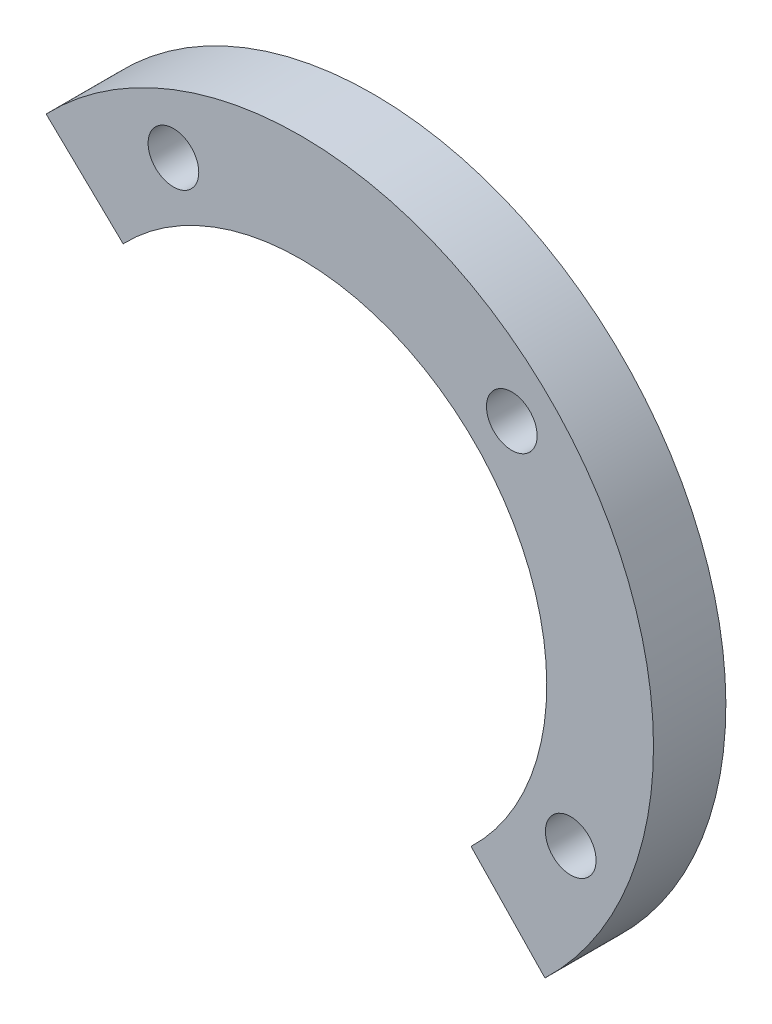
ISO-10303-21;
HEADER;
FILE_DESCRIPTION(('STEP AP214'),'2;1');
FILE_NAME('part.step','',(''),(''),'','','');
FILE_SCHEMA(('AUTOMOTIVE_DESIGN { 1 0 10303 214 1 1 1 1 }'));
ENDSEC;
DATA;
#1=APPLICATION_CONTEXT('core data for automotive mechanical design processes');
#2=APPLICATION_PROTOCOL_DEFINITION('international standard','automotive_design',2000,#1);
#3=PRODUCT_CONTEXT('',#1,'mechanical');
#4=PRODUCT('Part','Part','',(#3));
#5=PRODUCT_RELATED_PRODUCT_CATEGORY('part','',(#4));
#6=PRODUCT_DEFINITION_FORMATION('','',#4);
#7=PRODUCT_DEFINITION_CONTEXT('part definition',#1,'design');
#8=PRODUCT_DEFINITION('design','',#6,#7);
#9=PRODUCT_DEFINITION_SHAPE('','',#8);
#10=(LENGTH_UNIT() NAMED_UNIT(*) SI_UNIT(.MILLI.,.METRE.));
#11=(NAMED_UNIT(*) PLANE_ANGLE_UNIT() SI_UNIT($,.RADIAN.));
#12=(NAMED_UNIT(*) SI_UNIT($,.STERADIAN.) SOLID_ANGLE_UNIT());
#13=UNCERTAINTY_MEASURE_WITH_UNIT(LENGTH_MEASURE(1.E-05),#10,'distance_accuracy_value','');
#14=(GEOMETRIC_REPRESENTATION_CONTEXT(3) GLOBAL_UNCERTAINTY_ASSIGNED_CONTEXT((#13)) GLOBAL_UNIT_ASSIGNED_CONTEXT((#10,
#11,#12)) REPRESENTATION_CONTEXT('',''));
#15=CARTESIAN_POINT('',(0.,0.,0.));
#16=DIRECTION('',(0.,0.,1.));
#17=DIRECTION('',(1.,0.,0.));
#18=AXIS2_PLACEMENT_3D('',#15,#16,#17);
#19=CARTESIAN_POINT('',(0.,0.,0.));
#20=DIRECTION('',(0.,0.,1.));
#21=DIRECTION('',(1.,0.,0.));
#22=AXIS2_PLACEMENT_3D('',#19,#20,#21);
#23=PLANE('',#22);
#24=CARTESIAN_POINT('',(76.667261889578,76.6672618895781,0.));
#25=DIRECTION('',(0.,0.,1.));
#26=DIRECTION('',(1.,0.,0.));
#27=AXIS2_PLACEMENT_3D('',#24,#25,#26);
#28=CIRCLE('',#27,1.4);
#29=CARTESIAN_POINT('',(78.067261889578,76.6672618895781,0.));
#30=VERTEX_POINT('',#29);
#31=EDGE_CURVE('E385',#30,#30,#28,.T.);
#32=ORIENTED_EDGE('',*,*,#31,.T.);
#33=EDGE_LOOP('',(#32));
#34=FACE_BOUND('',#33,.T.);
#35=CARTESIAN_POINT('',(79.9252814189537,57.9653731751401,0.));
#36=DIRECTION('',(0.,0.,1.));
#37=DIRECTION('',(1.,0.,0.));
#38=AXIS2_PLACEMENT_3D('',#35,#36,#37);
#39=CIRCLE('',#38,1.40000000000002);
#40=CARTESIAN_POINT('',(81.3252814189537,57.9653731751401,0.));
#41=VERTEX_POINT('',#40);
#42=EDGE_CURVE('E410',#41,#41,#39,.T.);
#43=ORIENTED_EDGE('',*,*,#42,.T.);
#44=EDGE_LOOP('',(#43));
#45=FACE_BOUND('',#44,.T.);
#46=CARTESIAN_POINT('',(64.9999999999999,65.,0.));
#47=DIRECTION('',(0.,0.,1.));
#48=DIRECTION('',(1.,0.,0.));
#49=AXIS2_PLACEMENT_3D('',#46,#47,#48);
#50=CIRCLE('',#49,13.6000000000001);
#51=CARTESIAN_POINT('',(74.4153846153846,55.1862070256003,0.));
#52=VERTEX_POINT('',#51);
#53=CARTESIAN_POINT('',(55.1862070256001,74.4153846153847,0.));
#54=VERTEX_POINT('',#53);
#55=EDGE_CURVE('E400',#52,#54,#50,.T.);
#56=ORIENTED_EDGE('',*,*,#55,.T.);
#57=DIRECTION('',(0.721602424588225,-0.692307692307687,0.));
#58=VECTOR('',#57,1.);
#59=CARTESIAN_POINT('',(63.6259552603156,66.3182629526243,0.));
#60=LINE('',#59,#58);
#61=CARTESIAN_POINT('',(50.9287527205296,78.5,0.));
#62=VERTEX_POINT('',#61);
#63=EDGE_CURVE('E408',#62,#54,#60,.T.);
#64=ORIENTED_EDGE('',*,*,#63,.F.);
#65=CARTESIAN_POINT('',(64.9999999999999,65.,0.));
#66=DIRECTION('',(0.,0.,1.));
#67=DIRECTION('',(1.,0.,0.));
#68=AXIS2_PLACEMENT_3D('',#65,#66,#67);
#69=CIRCLE('',#68,19.5);
#70=CARTESIAN_POINT('',(78.5,50.9287527205298,0.));
#71=VERTEX_POINT('',#70);
#72=EDGE_CURVE('E406',#71,#62,#69,.T.);
#73=ORIENTED_EDGE('',*,*,#72,.F.);
#74=DIRECTION('',(-0.692307692307695,0.721602424588217,0.));
#75=VECTOR('',#74,1.);
#76=CARTESIAN_POINT('',(66.3182629526235,63.6259552603163,0.));
#77=LINE('',#76,#75);
#78=EDGE_CURVE('E403',#71,#52,#77,.T.);
#79=ORIENTED_EDGE('',*,*,#78,.T.);
#80=EDGE_LOOP('',(#56,#64,#73,#79));
#81=FACE_BOUND('',#80,.T.);
#82=CARTESIAN_POINT('',(57.8086613037912,78.0450495101681,0.));
#83=DIRECTION('',(0.,0.,1.));
#84=DIRECTION('',(1.,0.,0.));
#85=AXIS2_PLACEMENT_3D('',#82,#83,#84);
#86=CIRCLE('',#85,1.);
#87=CARTESIAN_POINT('',(56.9040987935516,77.6187084904796,0.));
#88=VERTEX_POINT('',#87);
#89=CARTESIAN_POINT('',(58.6301647126365,77.4748459068337,0.));
#90=VERTEX_POINT('',#89);
#91=EDGE_CURVE('E358',#88,#90,#86,.T.);
#92=ORIENTED_EDGE('',*,*,#91,.T.);
#93=DIRECTION('',(0.904562510239611,0.426341019688481,0.));
#94=VECTOR('',#93,1.);
#95=CARTESIAN_POINT('',(57.725602202397,77.0485048871453,0.));
#96=LINE('',#95,#94);
#97=CARTESIAN_POINT('',(59.4322867360858,77.8529043798754,0.));
#98=VERTEX_POINT('',#97);
#99=EDGE_CURVE('E664',#90,#98,#96,.T.);
#100=ORIENTED_EDGE('',*,*,#99,.T.);
#101=CARTESIAN_POINT('',(59.51534583748,78.8494490028982,0.));
#102=DIRECTION('',(0.,0.,1.));
#103=DIRECTION('',(1.,0.,0.));
#104=AXIS2_PLACEMENT_3D('',#101,#102,#103);
#105=CIRCLE('',#104,0.999999999999998);
#106=CARTESIAN_POINT('',(60.4199083477196,79.2757900225866,0.));
#107=VERTEX_POINT('',#106);
#108=EDGE_CURVE('E364',#98,#107,#105,.T.);
#109=ORIENTED_EDGE('',*,*,#108,.T.);
#110=DIRECTION('',(0.0830591013942119,0.996544623022766,0.));
#111=VECTOR('',#110,1.);
#112=CARTESIAN_POINT('',(60.3368492463254,78.2792453995639,0.));
#113=LINE('',#112,#111);
#114=CARTESIAN_POINT('',(60.4935611176742,80.1594773083495,0.));
#115=VERTEX_POINT('',#114);
#116=EDGE_CURVE('E349',#107,#115,#113,.T.);
#117=ORIENTED_EDGE('',*,*,#116,.T.);
#118=CARTESIAN_POINT('',(59.6720577088288,80.7296809116838,0.));
#119=DIRECTION('',(0.,0.,1.));
#120=DIRECTION('',(1.,0.,0.));
#121=AXIS2_PLACEMENT_3D('',#118,#119,#120);
#122=CIRCLE('',#121,1.);
#123=CARTESIAN_POINT('',(59.755116810223,81.7262255347065,0.));
#124=VERTEX_POINT('',#123);
#125=EDGE_CURVE('E370',#115,#124,#122,.T.);
#126=ORIENTED_EDGE('',*,*,#125,.T.);
#127=DIRECTION('',(-0.821503408845396,0.570203603334278,0.));
#128=VECTOR('',#127,1.);
#129=CARTESIAN_POINT('',(60.5766202190684,81.1560219313723,0.));
#130=LINE('',#129,#128);
#131=CARTESIAN_POINT('',(59.0266475567284,82.2318543474276,0.));
#132=VERTEX_POINT('',#131);
#133=EDGE_CURVE('E345',#124,#132,#130,.T.);
#134=ORIENTED_EDGE('',*,*,#133,.T.);
#135=CARTESIAN_POINT('',(58.1220850464888,81.8055133277392,0.));
#136=DIRECTION('',(0.,0.,1.));
#137=DIRECTION('',(1.,0.,0.));
#138=AXIS2_PLACEMENT_3D('',#135,#136,#137);
#139=CIRCLE('',#138,1.);
#140=CARTESIAN_POINT('',(57.3005816376434,82.3757169310735,0.));
#141=VERTEX_POINT('',#140);
#142=EDGE_CURVE('E343',#132,#141,#139,.T.);
#143=ORIENTED_EDGE('',*,*,#142,.T.);
#144=DIRECTION('',(-0.904562510239611,-0.426341019688481,0.));
#145=VECTOR('',#144,1.);
#146=CARTESIAN_POINT('',(58.205144147883,82.8020579507619,0.));
#147=LINE('',#146,#145);
#148=CARTESIAN_POINT('',(56.4984596141942,81.9976584580318,0.));
#149=VERTEX_POINT('',#148);
#150=EDGE_CURVE('E322',#141,#149,#147,.T.);
#151=ORIENTED_EDGE('',*,*,#150,.T.);
#152=CARTESIAN_POINT('',(56.4154005127999,81.0011138350091,0.));
#153=DIRECTION('',(0.,0.,1.));
#154=DIRECTION('',(1.,0.,0.));
#155=AXIS2_PLACEMENT_3D('',#152,#153,#154);
#156=CIRCLE('',#155,0.999999999999993);
#157=CARTESIAN_POINT('',(55.5108380025603,80.5747728153206,0.));
#158=VERTEX_POINT('',#157);
#159=EDGE_CURVE('E332',#149,#158,#156,.T.);
#160=ORIENTED_EDGE('',*,*,#159,.T.);
#161=DIRECTION('',(-0.083059101394217,-0.996544623022765,0.));
#162=VECTOR('',#161,1.);
#163=CARTESIAN_POINT('',(55.5938971039546,81.5713174383433,0.));
#164=LINE('',#163,#162);
#165=CARTESIAN_POINT('',(55.4371852326058,79.6910855295578,0.));
#166=VERTEX_POINT('',#165);
#167=EDGE_CURVE('E344',#158,#166,#164,.T.);
#168=ORIENTED_EDGE('',*,*,#167,.T.);
#169=CARTESIAN_POINT('',(56.2586886414512,79.1208819262235,0.));
#170=DIRECTION('',(0.,0.,1.));
#171=DIRECTION('',(1.,0.,0.));
#172=AXIS2_PLACEMENT_3D('',#169,#170,#171);
#173=CIRCLE('',#172,1.00000000000001);
#174=CARTESIAN_POINT('',(56.175629540057,78.1243373032007,0.));
#175=VERTEX_POINT('',#174);
#176=EDGE_CURVE('E213',#166,#175,#173,.T.);
#177=ORIENTED_EDGE('',*,*,#176,.T.);
#178=DIRECTION('',(0.821503408845395,-0.570203603334279,0.));
#179=VECTOR('',#178,1.);
#180=CARTESIAN_POINT('',(55.3541261312116,78.694540906535,0.));
#181=LINE('',#180,#179);
#182=EDGE_CURVE('E661',#175,#88,#181,.T.);
#183=ORIENTED_EDGE('',*,*,#182,.T.);
#184=EDGE_LOOP('',(#92,#100,#109,#117,#126,#134,#143,#151,#160,#168,#177,#183));
#185=FACE_BOUND('',#184,.T.);
#186=ADVANCED_FACE('F197',(#34,#45,#81,#185),#23,.F.);
#187=CARTESIAN_POINT('',(64.9999999999999,65.,4.));
#188=DIRECTION('',(0.,0.,-1.));
#189=DIRECTION('',(-1.,0.,0.));
#190=AXIS2_PLACEMENT_3D('',#187,#188,#189);
#191=CYLINDRICAL_SURFACE('',#190,13.6000000000001);
#192=ORIENTED_EDGE('',*,*,#55,.F.);
#193=DIRECTION('',(0.,0.,-1.));
#194=VECTOR('',#193,1.);
#195=CARTESIAN_POINT('',(74.4153846153846,55.1862070256003,4.));
#196=LINE('',#195,#194);
#197=CARTESIAN_POINT('',(74.4153846153846,55.1862070256003,4.));
#198=VERTEX_POINT('',#197);
#199=EDGE_CURVE('E12',#198,#52,#196,.T.);
#200=ORIENTED_EDGE('',*,*,#199,.F.);
#201=CARTESIAN_POINT('',(64.9999999999999,65.,4.));
#202=DIRECTION('',(0.,0.,1.));
#203=DIRECTION('',(1.,0.,0.));
#204=AXIS2_PLACEMENT_3D('',#201,#202,#203);
#205=CIRCLE('',#204,13.6000000000001);
#206=CARTESIAN_POINT('',(55.1862070256001,74.4153846153847,4.));
#207=VERTEX_POINT('',#206);
#208=EDGE_CURVE('E382',#198,#207,#205,.T.);
#209=ORIENTED_EDGE('',*,*,#208,.T.);
#210=DIRECTION('',(0.,0.,-1.));
#211=VECTOR('',#210,1.);
#212=CARTESIAN_POINT('',(55.1862070256001,74.4153846153847,4.));
#213=LINE('',#212,#211);
#214=EDGE_CURVE('E242',#207,#54,#213,.T.);
#215=ORIENTED_EDGE('',*,*,#214,.T.);
#216=EDGE_LOOP('',(#192,#200,#209,#215));
#217=FACE_BOUND('',#216,.T.);
#218=ADVANCED_FACE('F199',(#217),#191,.F.);
#219=CARTESIAN_POINT('',(66.3182629526235,63.6259552603163,4.));
#220=DIRECTION('',(-0.721602424588217,-0.692307692307695,0.));
#221=DIRECTION('',(0.692307692307695,-0.721602424588217,0.));
#222=AXIS2_PLACEMENT_3D('',#219,#220,#221);
#223=PLANE('',#222);
#224=ORIENTED_EDGE('',*,*,#78,.F.);
#225=DIRECTION('',(0.,0.,-1.));
#226=VECTOR('',#225,1.);
#227=CARTESIAN_POINT('',(78.5,50.9287527205298,4.));
#228=LINE('',#227,#226);
#229=CARTESIAN_POINT('',(78.5,50.9287527205298,4.));
#230=VERTEX_POINT('',#229);
#231=EDGE_CURVE('E206',#230,#71,#228,.T.);
#232=ORIENTED_EDGE('',*,*,#231,.F.);
#233=DIRECTION('',(-0.692307692307695,0.721602424588217,0.));
#234=VECTOR('',#233,1.);
#235=CARTESIAN_POINT('',(66.3182629526235,63.6259552603163,4.));
#236=LINE('',#235,#234);
#237=EDGE_CURVE('E384',#230,#198,#236,.T.);
#238=ORIENTED_EDGE('',*,*,#237,.T.);
#239=ORIENTED_EDGE('',*,*,#199,.T.);
#240=EDGE_LOOP('',(#224,#232,#238,#239));
#241=FACE_BOUND('',#240,.T.);
#242=ADVANCED_FACE('F429',(#241),#223,.T.);
#243=CARTESIAN_POINT('',(64.9999999999999,65.,4.));
#244=DIRECTION('',(0.,0.,-1.));
#245=DIRECTION('',(-1.,0.,0.));
#246=AXIS2_PLACEMENT_3D('',#243,#244,#245);
#247=CYLINDRICAL_SURFACE('',#246,19.5);
#248=ORIENTED_EDGE('',*,*,#72,.T.);
#249=DIRECTION('',(0.,0.,-1.));
#250=VECTOR('',#249,1.);
#251=CARTESIAN_POINT('',(50.9287527205296,78.5,4.));
#252=LINE('',#251,#250);
#253=CARTESIAN_POINT('',(50.9287527205296,78.5,4.));
#254=VERTEX_POINT('',#253);
#255=EDGE_CURVE('E416',#254,#62,#252,.T.);
#256=ORIENTED_EDGE('',*,*,#255,.F.);
#257=CARTESIAN_POINT('',(64.9999999999999,65.,4.));
#258=DIRECTION('',(0.,0.,1.));
#259=DIRECTION('',(1.,0.,0.));
#260=AXIS2_PLACEMENT_3D('',#257,#258,#259);
#261=CIRCLE('',#260,19.5);
#262=EDGE_CURVE('E388',#230,#254,#261,.T.);
#263=ORIENTED_EDGE('',*,*,#262,.F.);
#264=ORIENTED_EDGE('',*,*,#231,.T.);
#265=EDGE_LOOP('',(#248,#256,#263,#264));
#266=FACE_BOUND('',#265,.T.);
#267=ADVANCED_FACE('F422',(#266),#247,.T.);
#268=CARTESIAN_POINT('',(76.667261889578,76.6672618895781,4.));
#269=DIRECTION('',(0.,0.,-1.));
#270=DIRECTION('',(-1.,0.,0.));
#271=AXIS2_PLACEMENT_3D('',#268,#269,#270);
#272=CYLINDRICAL_SURFACE('',#271,1.4);
#273=CARTESIAN_POINT('',(76.667261889578,76.6672618895781,4.));
#274=DIRECTION('',(0.,0.,1.));
#275=DIRECTION('',(1.,0.,0.));
#276=AXIS2_PLACEMENT_3D('',#273,#274,#275);
#277=CIRCLE('',#276,1.4);
#278=CARTESIAN_POINT('',(78.067261889578,76.6672618895781,4.));
#279=VERTEX_POINT('',#278);
#280=EDGE_CURVE('E394',#279,#279,#277,.T.);
#281=ORIENTED_EDGE('',*,*,#280,.T.);
#282=EDGE_LOOP('',(#281));
#283=FACE_BOUND('',#282,.T.);
#284=ORIENTED_EDGE('',*,*,#31,.F.);
#285=EDGE_LOOP('',(#284));
#286=FACE_BOUND('',#285,.T.);
#287=ADVANCED_FACE('F449',(#283,#286),#272,.F.);
#288=CARTESIAN_POINT('',(79.9252814189537,57.9653731751401,4.));
#289=DIRECTION('',(0.,0.,-1.));
#290=DIRECTION('',(-1.,0.,0.));
#291=AXIS2_PLACEMENT_3D('',#288,#289,#290);
#292=CYLINDRICAL_SURFACE('',#291,1.40000000000002);
#293=CARTESIAN_POINT('',(79.9252814189537,57.9653731751401,4.));
#294=DIRECTION('',(0.,0.,1.));
#295=DIRECTION('',(1.,0.,0.));
#296=AXIS2_PLACEMENT_3D('',#293,#294,#295);
#297=CIRCLE('',#296,1.40000000000002);
#298=CARTESIAN_POINT('',(81.3252814189537,57.9653731751401,4.));
#299=VERTEX_POINT('',#298);
#300=EDGE_CURVE('E391',#299,#299,#297,.T.);
#301=ORIENTED_EDGE('',*,*,#300,.T.);
#302=EDGE_LOOP('',(#301));
#303=FACE_BOUND('',#302,.T.);
#304=ORIENTED_EDGE('',*,*,#42,.F.);
#305=EDGE_LOOP('',(#304));
#306=FACE_BOUND('',#305,.T.);
#307=ADVANCED_FACE('F452',(#303,#306),#292,.F.);
#308=CARTESIAN_POINT('',(63.6259552603156,66.3182629526243,4.));
#309=DIRECTION('',(0.692307692307687,0.721602424588225,0.));
#310=DIRECTION('',(-0.721602424588225,0.692307692307687,0.));
#311=AXIS2_PLACEMENT_3D('',#308,#309,#310);
#312=PLANE('',#311);
#313=ORIENTED_EDGE('',*,*,#63,.T.);
#314=ORIENTED_EDGE('',*,*,#214,.F.);
#315=DIRECTION('',(0.721602424588225,-0.692307692307687,0.));
#316=VECTOR('',#315,1.);
#317=CARTESIAN_POINT('',(63.6259552603156,66.3182629526243,4.));
#318=LINE('',#317,#316);
#319=EDGE_CURVE('E222',#254,#207,#318,.T.);
#320=ORIENTED_EDGE('',*,*,#319,.F.);
#321=ORIENTED_EDGE('',*,*,#255,.T.);
#322=EDGE_LOOP('',(#313,#314,#320,#321));
#323=FACE_BOUND('',#322,.T.);
#324=ADVANCED_FACE('F447',(#323),#312,.F.);
#325=CARTESIAN_POINT('',(57.96537317514,79.9252814189536,4.));
#326=DIRECTION('',(0.,0.,-1.));
#327=DIRECTION('',(-1.,0.,0.));
#328=AXIS2_PLACEMENT_3D('',#325,#326,#327);
#329=CYLINDRICAL_SURFACE('',#328,1.4);
#330=CARTESIAN_POINT('',(57.96537317514,79.9252814189536,2.));
#331=DIRECTION('',(0.,0.,1.));
#332=DIRECTION('',(1.,0.,0.));
#333=AXIS2_PLACEMENT_3D('',#330,#331,#332);
#334=CIRCLE('',#333,1.4);
#335=CARTESIAN_POINT('',(59.36537317514,79.9252814189536,2.));
#336=VERTEX_POINT('',#335);
#337=EDGE_CURVE('E201',#336,#336,#334,.T.);
#338=ORIENTED_EDGE('',*,*,#337,.F.);
#339=EDGE_LOOP('',(#338));
#340=FACE_BOUND('',#339,.T.);
#341=CARTESIAN_POINT('',(57.96537317514,79.9252814189536,4.));
#342=DIRECTION('',(0.,0.,1.));
#343=DIRECTION('',(1.,0.,0.));
#344=AXIS2_PLACEMENT_3D('',#341,#342,#343);
#345=CIRCLE('',#344,1.4);
#346=CARTESIAN_POINT('',(59.36537317514,79.9252814189536,4.));
#347=VERTEX_POINT('',#346);
#348=EDGE_CURVE('E397',#347,#347,#345,.T.);
#349=ORIENTED_EDGE('',*,*,#348,.T.);
#350=EDGE_LOOP('',(#349));
#351=FACE_BOUND('',#350,.T.);
#352=ADVANCED_FACE('F444',(#340,#351),#329,.F.);
#353=CARTESIAN_POINT('',(0.,0.,4.));
#354=DIRECTION('',(0.,0.,1.));
#355=DIRECTION('',(1.,0.,0.));
#356=AXIS2_PLACEMENT_3D('',#353,#354,#355);
#357=PLANE('',#356);
#358=ORIENTED_EDGE('',*,*,#208,.F.);
#359=ORIENTED_EDGE('',*,*,#237,.F.);
#360=ORIENTED_EDGE('',*,*,#262,.T.);
#361=ORIENTED_EDGE('',*,*,#319,.T.);
#362=EDGE_LOOP('',(#358,#359,#360,#361));
#363=FACE_BOUND('',#362,.T.);
#364=ORIENTED_EDGE('',*,*,#300,.F.);
#365=EDGE_LOOP('',(#364));
#366=FACE_BOUND('',#365,.T.);
#367=ORIENTED_EDGE('',*,*,#280,.F.);
#368=EDGE_LOOP('',(#367));
#369=FACE_BOUND('',#368,.T.);
#370=ORIENTED_EDGE('',*,*,#348,.F.);
#371=EDGE_LOOP('',(#370));
#372=FACE_BOUND('',#371,.T.);
#373=ADVANCED_FACE('F442',(#363,#366,#369,#372),#357,.T.);
#374=CARTESIAN_POINT('',(56.4154005127999,81.0011138350091,2.));
#375=DIRECTION('',(0.,0.,1.));
#376=DIRECTION('',(1.,0.,0.));
#377=AXIS2_PLACEMENT_3D('',#374,#375,#376);
#378=PLANE('',#377);
#379=ORIENTED_EDGE('',*,*,#337,.T.);
#380=EDGE_LOOP('',(#379));
#381=FACE_BOUND('',#380,.T.);
#382=DIRECTION('',(-0.083059101394217,-0.996544623022765,0.));
#383=VECTOR('',#382,1.);
#384=CARTESIAN_POINT('',(55.5938971039546,81.5713174383433,2.));
#385=LINE('',#384,#383);
#386=CARTESIAN_POINT('',(55.5108380025603,80.5747728153206,2.));
#387=VERTEX_POINT('',#386);
#388=CARTESIAN_POINT('',(55.4371852326058,79.6910855295578,2.));
#389=VERTEX_POINT('',#388);
#390=EDGE_CURVE('E637',#387,#389,#385,.T.);
#391=ORIENTED_EDGE('',*,*,#390,.F.);
#392=CARTESIAN_POINT('',(56.4154005127999,81.0011138350091,2.));
#393=DIRECTION('',(0.,0.,1.));
#394=DIRECTION('',(1.,0.,0.));
#395=AXIS2_PLACEMENT_3D('',#392,#393,#394);
#396=CIRCLE('',#395,0.999999999999993);
#397=CARTESIAN_POINT('',(56.4984596141942,81.9976584580318,2.));
#398=VERTEX_POINT('',#397);
#399=EDGE_CURVE('E329',#398,#387,#396,.T.);
#400=ORIENTED_EDGE('',*,*,#399,.F.);
#401=DIRECTION('',(-0.904562510239611,-0.426341019688481,0.));
#402=VECTOR('',#401,1.);
#403=CARTESIAN_POINT('',(58.205144147883,82.8020579507619,2.));
#404=LINE('',#403,#402);
#405=CARTESIAN_POINT('',(57.3005816376434,82.3757169310735,2.));
#406=VERTEX_POINT('',#405);
#407=EDGE_CURVE('E325',#406,#398,#404,.T.);
#408=ORIENTED_EDGE('',*,*,#407,.F.);
#409=CARTESIAN_POINT('',(58.1220850464888,81.8055133277392,2.));
#410=DIRECTION('',(0.,0.,1.));
#411=DIRECTION('',(1.,0.,0.));
#412=AXIS2_PLACEMENT_3D('',#409,#410,#411);
#413=CIRCLE('',#412,1.);
#414=CARTESIAN_POINT('',(59.0266475567284,82.2318543474276,2.));
#415=VERTEX_POINT('',#414);
#416=EDGE_CURVE('E379',#415,#406,#413,.T.);
#417=ORIENTED_EDGE('',*,*,#416,.F.);
#418=DIRECTION('',(-0.821503408845396,0.570203603334278,0.));
#419=VECTOR('',#418,1.);
#420=CARTESIAN_POINT('',(60.5766202190684,81.1560219313723,2.));
#421=LINE('',#420,#419);
#422=CARTESIAN_POINT('',(59.755116810223,81.7262255347065,2.));
#423=VERTEX_POINT('',#422);
#424=EDGE_CURVE('E657',#423,#415,#421,.T.);
#425=ORIENTED_EDGE('',*,*,#424,.F.);
#426=CARTESIAN_POINT('',(59.6720577088288,80.7296809116838,2.));
#427=DIRECTION('',(0.,0.,1.));
#428=DIRECTION('',(1.,0.,0.));
#429=AXIS2_PLACEMENT_3D('',#426,#427,#428);
#430=CIRCLE('',#429,1.);
#431=CARTESIAN_POINT('',(60.4935611176742,80.1594773083495,2.));
#432=VERTEX_POINT('',#431);
#433=EDGE_CURVE('E375',#432,#423,#430,.T.);
#434=ORIENTED_EDGE('',*,*,#433,.F.);
#435=DIRECTION('',(0.0830591013942119,0.996544623022766,0.));
#436=VECTOR('',#435,1.);
#437=CARTESIAN_POINT('',(60.3368492463254,78.2792453995639,2.));
#438=LINE('',#437,#436);
#439=CARTESIAN_POINT('',(60.4199083477196,79.2757900225866,2.));
#440=VERTEX_POINT('',#439);
#441=EDGE_CURVE('E654',#440,#432,#438,.T.);
#442=ORIENTED_EDGE('',*,*,#441,.F.);
#443=CARTESIAN_POINT('',(59.51534583748,78.8494490028982,2.));
#444=DIRECTION('',(0.,0.,1.));
#445=DIRECTION('',(1.,0.,0.));
#446=AXIS2_PLACEMENT_3D('',#443,#444,#445);
#447=CIRCLE('',#446,0.999999999999998);
#448=CARTESIAN_POINT('',(59.4322867360858,77.8529043798754,2.));
#449=VERTEX_POINT('',#448);
#450=EDGE_CURVE('E368',#449,#440,#447,.T.);
#451=ORIENTED_EDGE('',*,*,#450,.F.);
#452=DIRECTION('',(0.904562510239611,0.426341019688481,0.));
#453=VECTOR('',#452,1.);
#454=CARTESIAN_POINT('',(57.725602202397,77.0485048871453,2.));
#455=LINE('',#454,#453);
#456=CARTESIAN_POINT('',(58.6301647126365,77.4748459068337,2.));
#457=VERTEX_POINT('',#456);
#458=EDGE_CURVE('E651',#457,#449,#455,.T.);
#459=ORIENTED_EDGE('',*,*,#458,.F.);
#460=CARTESIAN_POINT('',(57.8086613037912,78.0450495101681,2.));
#461=DIRECTION('',(0.,0.,1.));
#462=DIRECTION('',(1.,0.,0.));
#463=AXIS2_PLACEMENT_3D('',#460,#461,#462);
#464=CIRCLE('',#463,1.);
#465=CARTESIAN_POINT('',(56.9040987935516,77.6187084904796,2.));
#466=VERTEX_POINT('',#465);
#467=EDGE_CURVE('E362',#466,#457,#464,.T.);
#468=ORIENTED_EDGE('',*,*,#467,.F.);
#469=DIRECTION('',(0.821503408845395,-0.570203603334279,0.));
#470=VECTOR('',#469,1.);
#471=CARTESIAN_POINT('',(55.3541261312116,78.694540906535,2.));
#472=LINE('',#471,#470);
#473=CARTESIAN_POINT('',(56.175629540057,78.1243373032007,2.));
#474=VERTEX_POINT('',#473);
#475=EDGE_CURVE('E347',#474,#466,#472,.T.);
#476=ORIENTED_EDGE('',*,*,#475,.F.);
#477=CARTESIAN_POINT('',(56.2586886414512,79.1208819262235,2.));
#478=DIRECTION('',(0.,0.,1.));
#479=DIRECTION('',(1.,0.,0.));
#480=AXIS2_PLACEMENT_3D('',#477,#478,#479);
#481=CIRCLE('',#480,1.00000000000001);
#482=EDGE_CURVE('E356',#389,#474,#481,.T.);
#483=ORIENTED_EDGE('',*,*,#482,.F.);
#484=EDGE_LOOP('',(#391,#400,#408,#417,#425,#434,#442,#451,#459,#468,#476,#483));
#485=FACE_BOUND('',#484,.T.);
#486=ADVANCED_FACE('F488',(#381,#485),#378,.F.);
#487=CARTESIAN_POINT('',(56.4154005127999,81.0011138350091,2.));
#488=DIRECTION('',(0.,0.,-1.));
#489=DIRECTION('',(-1.,0.,0.));
#490=AXIS2_PLACEMENT_3D('',#487,#488,#489);
#491=CYLINDRICAL_SURFACE('',#490,0.999999999999993);
#492=ORIENTED_EDGE('',*,*,#159,.F.);
#493=DIRECTION('',(0.,0.,-1.));
#494=VECTOR('',#493,1.);
#495=CARTESIAN_POINT('',(56.4984596141942,81.9976584580318,2.));
#496=LINE('',#495,#494);
#497=EDGE_CURVE('E317',#149,#398,#496,.F.);
#498=ORIENTED_EDGE('',*,*,#497,.T.);
#499=ORIENTED_EDGE('',*,*,#399,.T.);
#500=DIRECTION('',(0.,0.,-1.));
#501=VECTOR('',#500,1.);
#502=CARTESIAN_POINT('',(55.5108380025603,80.5747728153206,2.));
#503=LINE('',#502,#501);
#504=EDGE_CURVE('E328',#387,#158,#503,.T.);
#505=ORIENTED_EDGE('',*,*,#504,.T.);
#506=EDGE_LOOP('',(#492,#498,#499,#505));
#507=FACE_BOUND('',#506,.T.);
#508=ADVANCED_FACE('F333',(#507),#491,.F.);
#509=CARTESIAN_POINT('',(57.8086613037912,78.0450495101681,2.));
#510=DIRECTION('',(0.,0.,-1.));
#511=DIRECTION('',(-1.,0.,0.));
#512=AXIS2_PLACEMENT_3D('',#509,#510,#511);
#513=CYLINDRICAL_SURFACE('',#512,1.);
#514=ORIENTED_EDGE('',*,*,#91,.F.);
#515=DIRECTION('',(0.,0.,-1.));
#516=VECTOR('',#515,1.);
#517=CARTESIAN_POINT('',(56.9040987935515,77.6187084904796,2.));
#518=LINE('',#517,#516);
#519=EDGE_CURVE('E359',#88,#466,#518,.F.);
#520=ORIENTED_EDGE('',*,*,#519,.T.);
#521=ORIENTED_EDGE('',*,*,#467,.T.);
#522=DIRECTION('',(0.,0.,-1.));
#523=VECTOR('',#522,1.);
#524=CARTESIAN_POINT('',(58.6301647126365,77.4748459068337,2.));
#525=LINE('',#524,#523);
#526=EDGE_CURVE('E361',#457,#90,#525,.T.);
#527=ORIENTED_EDGE('',*,*,#526,.T.);
#528=EDGE_LOOP('',(#514,#520,#521,#527));
#529=FACE_BOUND('',#528,.T.);
#530=ADVANCED_FACE('F500',(#529),#513,.F.);
#531=CARTESIAN_POINT('',(57.725602202397,77.0485048871453,2.));
#532=DIRECTION('',(-0.426341019688481,0.904562510239611,0.));
#533=DIRECTION('',(-0.904562510239611,-0.426341019688481,0.));
#534=AXIS2_PLACEMENT_3D('',#531,#532,#533);
#535=PLANE('',#534);
#536=ORIENTED_EDGE('',*,*,#99,.F.);
#537=ORIENTED_EDGE('',*,*,#526,.F.);
#538=ORIENTED_EDGE('',*,*,#458,.T.);
#539=DIRECTION('',(0.,0.,-1.));
#540=VECTOR('',#539,1.);
#541=CARTESIAN_POINT('',(59.4322867360858,77.8529043798754,2.));
#542=LINE('',#541,#540);
#543=EDGE_CURVE('E365',#98,#449,#542,.F.);
#544=ORIENTED_EDGE('',*,*,#543,.F.);
#545=EDGE_LOOP('',(#536,#537,#538,#544));
#546=FACE_BOUND('',#545,.T.);
#547=ADVANCED_FACE('F507',(#546),#535,.T.);
#548=CARTESIAN_POINT('',(59.51534583748,78.8494490028982,2.));
#549=DIRECTION('',(0.,0.,-1.));
#550=DIRECTION('',(-1.,0.,0.));
#551=AXIS2_PLACEMENT_3D('',#548,#549,#550);
#552=CYLINDRICAL_SURFACE('',#551,0.999999999999998);
#553=ORIENTED_EDGE('',*,*,#108,.F.);
#554=ORIENTED_EDGE('',*,*,#543,.T.);
#555=ORIENTED_EDGE('',*,*,#450,.T.);
#556=DIRECTION('',(0.,0.,-1.));
#557=VECTOR('',#556,1.);
#558=CARTESIAN_POINT('',(60.4199083477196,79.2757900225866,2.));
#559=LINE('',#558,#557);
#560=EDGE_CURVE('E367',#440,#107,#559,.T.);
#561=ORIENTED_EDGE('',*,*,#560,.T.);
#562=EDGE_LOOP('',(#553,#554,#555,#561));
#563=FACE_BOUND('',#562,.T.);
#564=ADVANCED_FACE('F515',(#563),#552,.F.);
#565=CARTESIAN_POINT('',(60.3368492463254,78.2792453995639,2.));
#566=DIRECTION('',(-0.996544623022766,0.0830591013942119,0.));
#567=DIRECTION('',(-0.0830591013942119,-0.996544623022766,0.));
#568=AXIS2_PLACEMENT_3D('',#565,#566,#567);
#569=PLANE('',#568);
#570=ORIENTED_EDGE('',*,*,#116,.F.);
#571=ORIENTED_EDGE('',*,*,#560,.F.);
#572=ORIENTED_EDGE('',*,*,#441,.T.);
#573=DIRECTION('',(0.,0.,-1.));
#574=VECTOR('',#573,1.);
#575=CARTESIAN_POINT('',(60.4935611176742,80.1594773083495,2.));
#576=LINE('',#575,#574);
#577=EDGE_CURVE('E371',#115,#432,#576,.F.);
#578=ORIENTED_EDGE('',*,*,#577,.F.);
#579=EDGE_LOOP('',(#570,#571,#572,#578));
#580=FACE_BOUND('',#579,.T.);
#581=ADVANCED_FACE('F523',(#580),#569,.T.);
#582=CARTESIAN_POINT('',(59.6720577088288,80.7296809116838,2.));
#583=DIRECTION('',(0.,0.,-1.));
#584=DIRECTION('',(-1.,0.,0.));
#585=AXIS2_PLACEMENT_3D('',#582,#583,#584);
#586=CYLINDRICAL_SURFACE('',#585,1.);
#587=ORIENTED_EDGE('',*,*,#577,.T.);
#588=ORIENTED_EDGE('',*,*,#433,.T.);
#589=DIRECTION('',(0.,0.,-1.));
#590=VECTOR('',#589,1.);
#591=CARTESIAN_POINT('',(59.755116810223,81.7262255347065,2.));
#592=LINE('',#591,#590);
#593=EDGE_CURVE('E374',#423,#124,#592,.T.);
#594=ORIENTED_EDGE('',*,*,#593,.T.);
#595=ORIENTED_EDGE('',*,*,#125,.F.);
#596=EDGE_LOOP('',(#587,#588,#594,#595));
#597=FACE_BOUND('',#596,.T.);
#598=ADVANCED_FACE('F531',(#597),#586,.F.);
#599=CARTESIAN_POINT('',(60.5766202190684,81.1560219313723,2.));
#600=DIRECTION('',(-0.570203603334278,-0.821503408845396,0.));
#601=DIRECTION('',(0.821503408845396,-0.570203603334278,0.));
#602=AXIS2_PLACEMENT_3D('',#599,#600,#601);
#603=PLANE('',#602);
#604=ORIENTED_EDGE('',*,*,#133,.F.);
#605=ORIENTED_EDGE('',*,*,#593,.F.);
#606=ORIENTED_EDGE('',*,*,#424,.T.);
#607=DIRECTION('',(0.,0.,-1.));
#608=VECTOR('',#607,1.);
#609=CARTESIAN_POINT('',(59.0266475567284,82.2318543474276,2.));
#610=LINE('',#609,#608);
#611=EDGE_CURVE('E377',#132,#415,#610,.F.);
#612=ORIENTED_EDGE('',*,*,#611,.F.);
#613=EDGE_LOOP('',(#604,#605,#606,#612));
#614=FACE_BOUND('',#613,.T.);
#615=ADVANCED_FACE('F539',(#614),#603,.T.);
#616=CARTESIAN_POINT('',(56.2586886414512,79.1208819262235,2.));
#617=DIRECTION('',(0.,0.,-1.));
#618=DIRECTION('',(-1.,0.,0.));
#619=AXIS2_PLACEMENT_3D('',#616,#617,#618);
#620=CYLINDRICAL_SURFACE('',#619,1.00000000000001);
#621=DIRECTION('',(0.,0.,-1.));
#622=VECTOR('',#621,1.);
#623=CARTESIAN_POINT('',(56.175629540057,78.1243373032007,2.));
#624=LINE('',#623,#622);
#625=EDGE_CURVE('E355',#474,#175,#624,.T.);
#626=ORIENTED_EDGE('',*,*,#625,.T.);
#627=ORIENTED_EDGE('',*,*,#176,.F.);
#628=DIRECTION('',(0.,0.,-1.));
#629=VECTOR('',#628,1.);
#630=CARTESIAN_POINT('',(55.4371852326058,79.6910855295578,2.));
#631=LINE('',#630,#629);
#632=EDGE_CURVE('E353',#166,#389,#631,.F.);
#633=ORIENTED_EDGE('',*,*,#632,.T.);
#634=ORIENTED_EDGE('',*,*,#482,.T.);
#635=EDGE_LOOP('',(#626,#627,#633,#634));
#636=FACE_BOUND('',#635,.T.);
#637=ADVANCED_FACE('F547',(#636),#620,.F.);
#638=CARTESIAN_POINT('',(55.3541261312116,78.694540906535,2.));
#639=DIRECTION('',(0.570203603334279,0.821503408845395,0.));
#640=DIRECTION('',(-0.821503408845395,0.570203603334279,0.));
#641=AXIS2_PLACEMENT_3D('',#638,#639,#640);
#642=PLANE('',#641);
#643=ORIENTED_EDGE('',*,*,#182,.F.);
#644=ORIENTED_EDGE('',*,*,#625,.F.);
#645=ORIENTED_EDGE('',*,*,#475,.T.);
#646=ORIENTED_EDGE('',*,*,#519,.F.);
#647=EDGE_LOOP('',(#643,#644,#645,#646));
#648=FACE_BOUND('',#647,.T.);
#649=ADVANCED_FACE('F555',(#648),#642,.T.);
#650=CARTESIAN_POINT('',(58.1220850464888,81.8055133277392,2.));
#651=DIRECTION('',(0.,0.,-1.));
#652=DIRECTION('',(-1.,0.,0.));
#653=AXIS2_PLACEMENT_3D('',#650,#651,#652);
#654=CYLINDRICAL_SURFACE('',#653,1.);
#655=DIRECTION('',(0.,0.,-1.));
#656=VECTOR('',#655,1.);
#657=CARTESIAN_POINT('',(57.3005816376434,82.3757169310735,2.));
#658=LINE('',#657,#656);
#659=EDGE_CURVE('E338',#406,#141,#658,.T.);
#660=ORIENTED_EDGE('',*,*,#659,.T.);
#661=ORIENTED_EDGE('',*,*,#142,.F.);
#662=ORIENTED_EDGE('',*,*,#611,.T.);
#663=ORIENTED_EDGE('',*,*,#416,.T.);
#664=EDGE_LOOP('',(#660,#661,#662,#663));
#665=FACE_BOUND('',#664,.T.);
#666=ADVANCED_FACE('F562',(#665),#654,.F.);
#667=CARTESIAN_POINT('',(58.205144147883,82.8020579507619,2.));
#668=DIRECTION('',(0.426341019688481,-0.904562510239611,0.));
#669=DIRECTION('',(0.904562510239611,0.426341019688481,0.));
#670=AXIS2_PLACEMENT_3D('',#667,#668,#669);
#671=PLANE('',#670);
#672=ORIENTED_EDGE('',*,*,#150,.F.);
#673=ORIENTED_EDGE('',*,*,#659,.F.);
#674=ORIENTED_EDGE('',*,*,#407,.T.);
#675=ORIENTED_EDGE('',*,*,#497,.F.);
#676=EDGE_LOOP('',(#672,#673,#674,#675));
#677=FACE_BOUND('',#676,.T.);
#678=ADVANCED_FACE('F319',(#677),#671,.T.);
#679=CARTESIAN_POINT('',(55.5938971039546,81.5713174383433,2.));
#680=DIRECTION('',(0.996544623022765,-0.083059101394217,0.));
#681=DIRECTION('',(0.083059101394217,0.996544623022765,0.));
#682=AXIS2_PLACEMENT_3D('',#679,#680,#681);
#683=PLANE('',#682);
#684=ORIENTED_EDGE('',*,*,#390,.T.);
#685=ORIENTED_EDGE('',*,*,#632,.F.);
#686=ORIENTED_EDGE('',*,*,#167,.F.);
#687=ORIENTED_EDGE('',*,*,#504,.F.);
#688=EDGE_LOOP('',(#684,#685,#686,#687));
#689=FACE_BOUND('',#688,.T.);
#690=ADVANCED_FACE('F576',(#689),#683,.T.);
#691=CLOSED_SHELL('',(#186,#218,#242,#267,#287,#307,#324,#352,#373,#486,#508,#530,#547,#564,
#581,#598,#615,#637,#649,#666,#678,#690));
#692=MANIFOLD_SOLID_BREP('B2',#691);
#693=ADVANCED_BREP_SHAPE_REPRESENTATION('',(#18,#692),#14);
#694=SHAPE_DEFINITION_REPRESENTATION(#9,#693);
ENDSEC;
END-ISO-10303-21;
